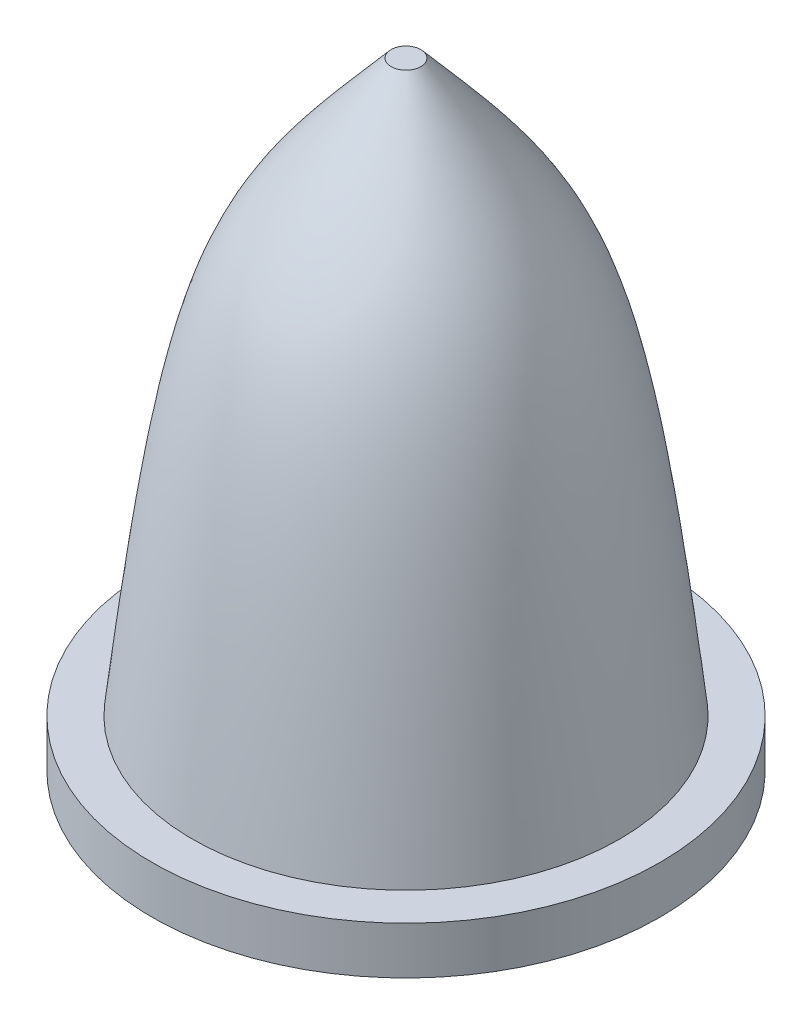
ISO-10303-21;
HEADER;
FILE_DESCRIPTION(('STEP AP214'),'2;1');
FILE_NAME('part.step','',(''),(''),'','','');
FILE_SCHEMA(('AUTOMOTIVE_DESIGN { 1 0 10303 214 1 1 1 1 }'));
ENDSEC;
DATA;
#1=APPLICATION_CONTEXT('core data for automotive mechanical design processes');
#2=APPLICATION_PROTOCOL_DEFINITION('international standard','automotive_design',2000,#1);
#3=PRODUCT_CONTEXT('',#1,'mechanical');
#4=PRODUCT('Part','Part','',(#3));
#5=PRODUCT_RELATED_PRODUCT_CATEGORY('part','',(#4));
#6=PRODUCT_DEFINITION_FORMATION('','',#4);
#7=PRODUCT_DEFINITION_CONTEXT('part definition',#1,'design');
#8=PRODUCT_DEFINITION('design','',#6,#7);
#9=PRODUCT_DEFINITION_SHAPE('','',#8);
#10=(LENGTH_UNIT() NAMED_UNIT(*) SI_UNIT(.MILLI.,.METRE.));
#11=(NAMED_UNIT(*) PLANE_ANGLE_UNIT() SI_UNIT($,.RADIAN.));
#12=(NAMED_UNIT(*) SI_UNIT($,.STERADIAN.) SOLID_ANGLE_UNIT());
#13=UNCERTAINTY_MEASURE_WITH_UNIT(LENGTH_MEASURE(1.E-05),#10,'distance_accuracy_value','');
#14=(GEOMETRIC_REPRESENTATION_CONTEXT(3) GLOBAL_UNCERTAINTY_ASSIGNED_CONTEXT((#13)) GLOBAL_UNIT_ASSIGNED_CONTEXT((#10,
#11,#12)) REPRESENTATION_CONTEXT('',''));
#15=CARTESIAN_POINT('',(0.,0.,0.));
#16=DIRECTION('',(0.,0.,1.));
#17=DIRECTION('',(1.,0.,0.));
#18=AXIS2_PLACEMENT_3D('',#15,#16,#17);
#19=CARTESIAN_POINT('',(0.,13.,0.));
#20=DIRECTION('',(0.,-1.,0.));
#21=DIRECTION('',(1.,0.,0.));
#22=AXIS2_PLACEMENT_3D('',#19,#20,#21);
#23=PLANE('',#22);
#24=CARTESIAN_POINT('',(0.,13.,0.));
#25=DIRECTION('',(0.,-1.,0.));
#26=DIRECTION('',(1.,0.,0.));
#27=AXIS2_PLACEMENT_3D('',#24,#25,#26);
#28=CIRCLE('',#27,0.312384473197691);
#29=CARTESIAN_POINT('',(0.312384473197646,13.,0.));
#30=VERTEX_POINT('',#29);
#31=EDGE_CURVE('E10',#30,#30,#28,.T.);
#32=ORIENTED_EDGE('',*,*,#31,.F.);
#33=EDGE_LOOP('',(#32));
#34=FACE_BOUND('',#33,.T.);
#35=ADVANCED_FACE('F43',(#34),#23,.F.);
#36=CARTESIAN_POINT('',(-0.312384473197735,13.,0.));
#37=CARTESIAN_POINT('',(-3.13132669569697,9.71720522276934,0.));
#38=CARTESIAN_POINT('',(-3.54801332836661,9.46208520361541,0.));
#39=CARTESIAN_POINT('',(-4.5,0.999999999999999,0.));
#40=B_SPLINE_CURVE_WITH_KNOTS('',3,(#36,#37,#38,#39),.UNSPECIFIED.,.F.,.F.,(4,4),(0.,
0.8733286303598),.UNSPECIFIED.);
#41=CARTESIAN_POINT('',(6.64089581594355E-13,-193.59806877287,0.));
#42=DIRECTION('',(0.,-1.,0.));
#43=AXIS1_PLACEMENT('',#41,#42);
#44=SURFACE_OF_REVOLUTION('',#40,#43);
#45=CARTESIAN_POINT('',(0.,1.00000000000003,0.));
#46=DIRECTION('',(0.,-1.,0.));
#47=DIRECTION('',(1.,0.,0.));
#48=AXIS2_PLACEMENT_3D('',#45,#46,#47);
#49=CIRCLE('',#48,4.5);
#50=CARTESIAN_POINT('',(4.49999999999999,1.00000000000004,0.));
#51=VERTEX_POINT('',#50);
#52=EDGE_CURVE('E50',#51,#51,#49,.T.);
#53=ORIENTED_EDGE('',*,*,#52,.F.);
#54=EDGE_LOOP('',(#53));
#55=FACE_BOUND('',#54,.T.);
#56=ORIENTED_EDGE('',*,*,#31,.T.);
#57=EDGE_LOOP('',(#56));
#58=FACE_BOUND('',#57,.T.);
#59=ADVANCED_FACE('F80',(#55,#58),#44,.T.);
#60=CARTESIAN_POINT('',(-5.35,0.999999999999998,0.));
#61=DIRECTION('',(0.,-1.,0.));
#62=DIRECTION('',(1.,0.,0.));
#63=AXIS2_PLACEMENT_3D('',#60,#61,#62);
#64=PLANE('',#63);
#65=CARTESIAN_POINT('',(0.,1.00000000000003,0.));
#66=DIRECTION('',(0.,-1.,0.));
#67=DIRECTION('',(1.,0.,0.));
#68=AXIS2_PLACEMENT_3D('',#65,#66,#67);
#69=CIRCLE('',#68,5.35);
#70=CARTESIAN_POINT('',(5.34999999999999,1.00000000000005,0.));
#71=VERTEX_POINT('',#70);
#72=EDGE_CURVE('E55',#71,#71,#69,.T.);
#73=ORIENTED_EDGE('',*,*,#72,.F.);
#74=EDGE_LOOP('',(#73));
#75=FACE_BOUND('',#74,.T.);
#76=ORIENTED_EDGE('',*,*,#52,.T.);
#77=EDGE_LOOP('',(#76));
#78=FACE_BOUND('',#77,.T.);
#79=ADVANCED_FACE('F83',(#75,#78),#64,.F.);
#80=CARTESIAN_POINT('',(6.64089581594355E-13,-193.59806877287,0.));
#81=DIRECTION('',(0.,-1.,0.));
#82=DIRECTION('',(1.,0.,0.));
#83=AXIS2_PLACEMENT_3D('',#80,#81,#82);
#84=CYLINDRICAL_SURFACE('',#83,5.35);
#85=CARTESIAN_POINT('',(0.,0.,0.));
#86=DIRECTION('',(0.,-1.,0.));
#87=DIRECTION('',(1.,0.,0.));
#88=AXIS2_PLACEMENT_3D('',#85,#86,#87);
#89=CIRCLE('',#88,5.35);
#90=CARTESIAN_POINT('',(5.35,0.,0.));
#91=VERTEX_POINT('',#90);
#92=EDGE_CURVE('E60',#91,#91,#89,.T.);
#93=ORIENTED_EDGE('',*,*,#92,.F.);
#94=EDGE_LOOP('',(#93));
#95=FACE_BOUND('',#94,.T.);
#96=ORIENTED_EDGE('',*,*,#72,.T.);
#97=EDGE_LOOP('',(#96));
#98=FACE_BOUND('',#97,.T.);
#99=ADVANCED_FACE('F87',(#95,#98),#84,.T.);
#100=CARTESIAN_POINT('',(-2.,0.,0.));
#101=DIRECTION('',(0.,1.,0.));
#102=DIRECTION('',(-1.,0.,0.));
#103=AXIS2_PLACEMENT_3D('',#100,#101,#102);
#104=PLANE('',#103);
#105=CARTESIAN_POINT('',(0.,0.,0.));
#106=DIRECTION('',(0.,-1.,0.));
#107=DIRECTION('',(1.,0.,0.));
#108=AXIS2_PLACEMENT_3D('',#105,#106,#107);
#109=CIRCLE('',#108,2.);
#110=CARTESIAN_POINT('',(2.,0.,0.));
#111=VERTEX_POINT('',#110);
#112=EDGE_CURVE('E66',#111,#111,#109,.T.);
#113=ORIENTED_EDGE('',*,*,#112,.F.);
#114=EDGE_LOOP('',(#113));
#115=FACE_BOUND('',#114,.T.);
#116=ORIENTED_EDGE('',*,*,#92,.T.);
#117=EDGE_LOOP('',(#116));
#118=FACE_BOUND('',#117,.T.);
#119=ADVANCED_FACE('F91',(#115,#118),#104,.F.);
#120=CARTESIAN_POINT('',(6.64089581594355E-13,-193.59806877287,0.));
#121=DIRECTION('',(0.,-1.,0.));
#122=DIRECTION('',(1.,0.,0.));
#123=AXIS2_PLACEMENT_3D('',#120,#121,#122);
#124=CYLINDRICAL_SURFACE('',#123,1.99999999999999);
#125=CARTESIAN_POINT('',(0.,3.26259575686474,0.));
#126=DIRECTION('',(0.,-1.,0.));
#127=DIRECTION('',(1.,0.,0.));
#128=AXIS2_PLACEMENT_3D('',#125,#126,#127);
#129=CIRCLE('',#128,1.99999999999999);
#130=CARTESIAN_POINT('',(1.99999999999998,3.26259575686475,0.));
#131=VERTEX_POINT('',#130);
#132=EDGE_CURVE('E70',#131,#131,#129,.T.);
#133=ORIENTED_EDGE('',*,*,#132,.F.);
#134=EDGE_LOOP('',(#133));
#135=FACE_BOUND('',#134,.T.);
#136=ORIENTED_EDGE('',*,*,#112,.T.);
#137=EDGE_LOOP('',(#136));
#138=FACE_BOUND('',#137,.T.);
#139=ADVANCED_FACE('F95',(#135,#138),#124,.F.);
#140=CARTESIAN_POINT('',(6.64087383174528E-13,3.26259575686476,0.));
#141=DIRECTION('',(0.,1.,0.));
#142=DIRECTION('',(-1.,0.,0.));
#143=AXIS2_PLACEMENT_3D('',#140,#141,#142);
#144=PLANE('',#143);
#145=ORIENTED_EDGE('',*,*,#132,.T.);
#146=EDGE_LOOP('',(#145));
#147=FACE_BOUND('',#146,.T.);
#148=ADVANCED_FACE('F99',(#147),#144,.F.);
#149=CLOSED_SHELL('',(#35,#59,#79,#99,#119,#139,#148));
#150=MANIFOLD_SOLID_BREP('B2',#149);
#151=ADVANCED_BREP_SHAPE_REPRESENTATION('',(#18,#150),#14);
#152=SHAPE_DEFINITION_REPRESENTATION(#9,#151);
ENDSEC;
END-ISO-10303-21;
